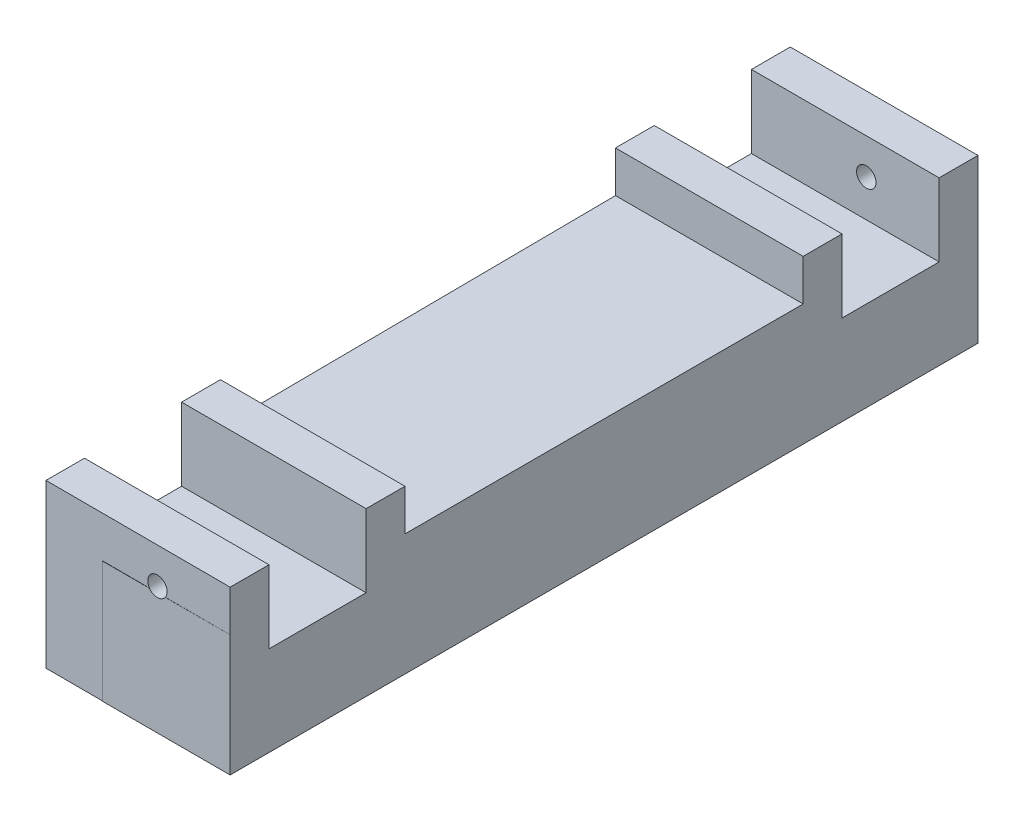
ISO-10303-21;
HEADER;
FILE_DESCRIPTION(('STEP AP214'),'2;1');
FILE_NAME('part.step','',(''),(''),'','','');
FILE_SCHEMA(('AUTOMOTIVE_DESIGN { 1 0 10303 214 1 1 1 1 }'));
ENDSEC;
DATA;
#1=APPLICATION_CONTEXT('core data for automotive mechanical design processes');
#2=APPLICATION_PROTOCOL_DEFINITION('international standard','automotive_design',2000,#1);
#3=PRODUCT_CONTEXT('',#1,'mechanical');
#4=PRODUCT('Part','Part','',(#3));
#5=PRODUCT_RELATED_PRODUCT_CATEGORY('part','',(#4));
#6=PRODUCT_DEFINITION_FORMATION('','',#4);
#7=PRODUCT_DEFINITION_CONTEXT('part definition',#1,'design');
#8=PRODUCT_DEFINITION('design','',#6,#7);
#9=PRODUCT_DEFINITION_SHAPE('','',#8);
#10=(LENGTH_UNIT() NAMED_UNIT(*) SI_UNIT(.MILLI.,.METRE.));
#11=(NAMED_UNIT(*) PLANE_ANGLE_UNIT() SI_UNIT($,.RADIAN.));
#12=(NAMED_UNIT(*) SI_UNIT($,.STERADIAN.) SOLID_ANGLE_UNIT());
#13=UNCERTAINTY_MEASURE_WITH_UNIT(LENGTH_MEASURE(1.E-05),#10,'distance_accuracy_value','');
#14=(GEOMETRIC_REPRESENTATION_CONTEXT(3) GLOBAL_UNCERTAINTY_ASSIGNED_CONTEXT((#13)) GLOBAL_UNIT_ASSIGNED_CONTEXT((#10,
#11,#12)) REPRESENTATION_CONTEXT('',''));
#15=CARTESIAN_POINT('',(0.,0.,0.));
#16=DIRECTION('',(0.,0.,1.));
#17=DIRECTION('',(1.,0.,0.));
#18=AXIS2_PLACEMENT_3D('',#15,#16,#17);
#19=CARTESIAN_POINT('',(0.,19.8480422527837,0.));
#20=DIRECTION('',(0.,1.,0.));
#21=DIRECTION('',(0.,0.,1.));
#22=AXIS2_PLACEMENT_3D('',#19,#20,#21);
#23=PLANE('',#22);
#24=DIRECTION('',(-1.,0.,0.));
#25=VECTOR('',#24,1.);
#26=CARTESIAN_POINT('',(30.,19.8480422527837,20.2557768746774));
#27=LINE('',#26,#25);
#28=CARTESIAN_POINT('',(30.,19.8480422527837,20.2557768746774));
#29=VERTEX_POINT('',#28);
#30=CARTESIAN_POINT('',(-8.,19.8480422527837,20.2557768746774));
#31=VERTEX_POINT('',#30);
#32=EDGE_CURVE('E230',#29,#31,#27,.T.);
#33=ORIENTED_EDGE('',*,*,#32,.T.);
#34=DIRECTION('',(0.,0.,1.));
#35=VECTOR('',#34,1.);
#36=CARTESIAN_POINT('',(-8.00000000000001,19.8480422527837,0.));
#37=LINE('',#36,#35);
#38=CARTESIAN_POINT('',(-8.,19.8480422527837,28.1760513106727));
#39=VERTEX_POINT('',#38);
#40=EDGE_CURVE('E217',#31,#39,#37,.T.);
#41=ORIENTED_EDGE('',*,*,#40,.T.);
#42=DIRECTION('',(0.999997799118915,0.,0.00209803654047904));
#43=VECTOR('',#42,1.);
#44=CARTESIAN_POINT('',(-8.,19.8480422527837,28.1760513106727));
#45=LINE('',#44,#43);
#46=CARTESIAN_POINT('',(3.71210697398439,19.8480422527837,28.2006237931513));
#47=VERTEX_POINT('',#46);
#48=EDGE_CURVE('E235',#39,#47,#45,.T.);
#49=ORIENTED_EDGE('',*,*,#48,.T.);
#50=DIRECTION('',(0.999997799118915,0.,0.00209803654047904));
#51=VECTOR('',#50,1.);
#52=CARTESIAN_POINT('',(-8.,19.8480422527837,28.1760513106727));
#53=LINE('',#52,#51);
#54=CARTESIAN_POINT('',(30.,19.8480422527837,28.2557768746774));
#55=VERTEX_POINT('',#54);
#56=EDGE_CURVE('E106',#47,#55,#53,.T.);
#57=ORIENTED_EDGE('',*,*,#56,.T.);
#58=DIRECTION('',(0.,0.,-1.));
#59=VECTOR('',#58,1.);
#60=CARTESIAN_POINT('',(30.,19.8480422527837,28.2557768746774));
#61=LINE('',#60,#59);
#62=EDGE_CURVE('E229',#55,#29,#61,.T.);
#63=ORIENTED_EDGE('',*,*,#62,.T.);
#64=EDGE_LOOP('',(#33,#41,#49,#57,#63));
#65=FACE_BOUND('',#64,.T.);
#66=ADVANCED_FACE('F50',(#65),#23,.T.);
#67=CARTESIAN_POINT('',(0.,19.8480422527837,0.));
#68=DIRECTION('',(0.,1.,0.));
#69=DIRECTION('',(0.,0.,1.));
#70=AXIS2_PLACEMENT_3D('',#67,#68,#69);
#71=PLANE('',#70);
#72=DIRECTION('',(-1.,0.,0.));
#73=VECTOR('',#72,1.);
#74=CARTESIAN_POINT('',(30.,19.8480422527837,-97.7442231253226));
#75=LINE('',#74,#73);
#76=CARTESIAN_POINT('',(30.,19.8480422527837,-97.7442231253226));
#77=VERTEX_POINT('',#76);
#78=CARTESIAN_POINT('',(-8.65807185361689,19.8480422527837,-97.7442231253226));
#79=VERTEX_POINT('',#78);
#80=EDGE_CURVE('E360',#77,#79,#75,.T.);
#81=ORIENTED_EDGE('',*,*,#80,.T.);
#82=DIRECTION('',(0.,0.,1.));
#83=VECTOR('',#82,1.);
#84=CARTESIAN_POINT('',(-8.65807185361689,19.8480422527837,0.));
#85=LINE('',#84,#83);
#86=CARTESIAN_POINT('',(-8.65807185361689,19.8480422527837,-89.7442231253226));
#87=VERTEX_POINT('',#86);
#88=EDGE_CURVE('E240',#79,#87,#85,.T.);
#89=ORIENTED_EDGE('',*,*,#88,.T.);
#90=DIRECTION('',(1.,0.,0.));
#91=VECTOR('',#90,1.);
#92=CARTESIAN_POINT('',(-8.65807185361689,19.8480422527837,-89.7442231253226));
#93=LINE('',#92,#91);
#94=CARTESIAN_POINT('',(30.,19.8480422527837,-89.7442231253226));
#95=VERTEX_POINT('',#94);
#96=EDGE_CURVE('E225',#87,#95,#93,.T.);
#97=ORIENTED_EDGE('',*,*,#96,.T.);
#98=DIRECTION('',(0.,0.,-1.));
#99=VECTOR('',#98,1.);
#100=CARTESIAN_POINT('',(30.,19.8480422527837,-89.7442231253226));
#101=LINE('',#100,#99);
#102=EDGE_CURVE('E358',#95,#77,#101,.T.);
#103=ORIENTED_EDGE('',*,*,#102,.T.);
#104=EDGE_LOOP('',(#81,#89,#97,#103));
#105=FACE_BOUND('',#104,.T.);
#106=ADVANCED_FACE('F489',(#105),#71,.T.);
#107=CARTESIAN_POINT('',(-8.65807185361689,19.8480422527837,-117.744223125323));
#108=DIRECTION('',(1.,0.,0.));
#109=DIRECTION('',(0.,0.,-1.));
#110=AXIS2_PLACEMENT_3D('',#107,#108,#109);
#111=PLANE('',#110);
#112=DIRECTION('',(0.,1.,0.));
#113=VECTOR('',#112,1.);
#114=CARTESIAN_POINT('',(-8.65807185361689,4.84804225278371,-97.7442231253226));
#115=LINE('',#114,#113);
#116=CARTESIAN_POINT('',(-8.65807185361689,4.84804225278371,-97.7442231253226));
#117=VERTEX_POINT('',#116);
#118=EDGE_CURVE('E281',#117,#79,#115,.T.);
#119=ORIENTED_EDGE('',*,*,#118,.F.);
#120=DIRECTION('',(0.,0.,1.));
#121=VECTOR('',#120,1.);
#122=CARTESIAN_POINT('',(-8.65807185361689,4.84804225278371,-117.744223125323));
#123=LINE('',#122,#121);
#124=CARTESIAN_POINT('',(-8.65807185361689,4.84804225278371,-117.744223125323));
#125=VERTEX_POINT('',#124);
#126=EDGE_CURVE('E54',#125,#117,#123,.T.);
#127=ORIENTED_EDGE('',*,*,#126,.F.);
#128=DIRECTION('',(0.,1.,0.));
#129=VECTOR('',#128,1.);
#130=CARTESIAN_POINT('',(-8.65807185361689,19.8480422527837,-117.744223125323));
#131=LINE('',#130,#129);
#132=CARTESIAN_POINT('',(-8.65807185361689,19.8480422527837,-117.744223125323));
#133=VERTEX_POINT('',#132);
#134=EDGE_CURVE('E11',#125,#133,#131,.T.);
#135=ORIENTED_EDGE('',*,*,#134,.T.);
#136=CARTESIAN_POINT('',(-8.65807185361689,19.8480422527837,-125.744223125323));
#137=VERTEX_POINT('',#136);
#138=EDGE_CURVE('E234',#137,#133,#85,.T.);
#139=ORIENTED_EDGE('',*,*,#138,.F.);
#140=DIRECTION('',(0.,-1.,0.));
#141=VECTOR('',#140,1.);
#142=CARTESIAN_POINT('',(-8.65807185361689,19.8480422527837,-125.744223125323));
#143=LINE('',#142,#141);
#144=CARTESIAN_POINT('',(-8.65807185361689,-13.6519577472163,-125.744223125323));
#145=VERTEX_POINT('',#144);
#146=EDGE_CURVE('E245',#137,#145,#143,.T.);
#147=ORIENTED_EDGE('',*,*,#146,.T.);
#148=DIRECTION('',(0.,0.,1.));
#149=VECTOR('',#148,1.);
#150=CARTESIAN_POINT('',(-8.65807185361689,-13.6519577472163,0.));
#151=LINE('',#150,#149);
#152=CARTESIAN_POINT('',(-8.65807185361689,-13.6519577472163,-89.7442231253226));
#153=VERTEX_POINT('',#152);
#154=EDGE_CURVE('E298',#145,#153,#151,.T.);
#155=ORIENTED_EDGE('',*,*,#154,.T.);
#156=DIRECTION('',(0.,1.,0.));
#157=VECTOR('',#156,1.);
#158=CARTESIAN_POINT('',(-8.65807185361689,-13.6519577472163,-89.7442231253226));
#159=LINE('',#158,#157);
#160=CARTESIAN_POINT('',(-8.65807185361689,11.3480422527837,-89.7442231253226));
#161=VERTEX_POINT('',#160);
#162=EDGE_CURVE('E71',#153,#161,#159,.T.);
#163=ORIENTED_EDGE('',*,*,#162,.T.);
#164=DIRECTION('',(0.,-1.,0.));
#165=VECTOR('',#164,1.);
#166=CARTESIAN_POINT('',(-8.65807185361689,19.8480422527837,-89.7442231253226));
#167=LINE('',#166,#165);
#168=EDGE_CURVE('E246',#87,#161,#167,.T.);
#169=ORIENTED_EDGE('',*,*,#168,.F.);
#170=ORIENTED_EDGE('',*,*,#88,.F.);
#171=EDGE_LOOP('',(#119,#127,#135,#139,#147,#155,#163,#169,#170));
#172=FACE_BOUND('',#171,.T.);
#173=ADVANCED_FACE('F283',(#172),#111,.F.);
#174=CARTESIAN_POINT('',(30.,11.3480422527837,0.255776874677423));
#175=DIRECTION('',(0.,-1.,0.));
#176=DIRECTION('',(0.,0.,-1.));
#177=AXIS2_PLACEMENT_3D('',#174,#175,#176);
#178=PLANE('',#177);
#179=DIRECTION('',(-0.00802500808675201,0.,-0.999967799104155));
#180=VECTOR('',#179,1.);
#181=CARTESIAN_POINT('',(-7.93335477392348,11.3480422527837,0.560202156262577));
#182=LINE('',#181,#180);
#183=CARTESIAN_POINT('',(-8.00000000000001,11.3480422527837,-7.74422312532257));
#184=VERTEX_POINT('',#183);
#185=EDGE_CURVE('E313',#184,#161,#182,.T.);
#186=ORIENTED_EDGE('',*,*,#185,.F.);
#187=DIRECTION('',(-1.,0.,0.));
#188=VECTOR('',#187,1.);
#189=CARTESIAN_POINT('',(30.,11.3480422527837,-7.74422312532258));
#190=LINE('',#189,#188);
#191=CARTESIAN_POINT('',(30.,11.3480422527837,-7.74422312532258));
#192=VERTEX_POINT('',#191);
#193=EDGE_CURVE('E350',#192,#184,#190,.T.);
#194=ORIENTED_EDGE('',*,*,#193,.F.);
#195=DIRECTION('',(0.,0.,1.));
#196=VECTOR('',#195,1.);
#197=CARTESIAN_POINT('',(30.,11.3480422527837,0.255776874677423));
#198=LINE('',#197,#196);
#199=CARTESIAN_POINT('',(30.,11.3480422527837,-89.7442231253226));
#200=VERTEX_POINT('',#199);
#201=EDGE_CURVE('E210',#200,#192,#198,.T.);
#202=ORIENTED_EDGE('',*,*,#201,.F.);
#203=DIRECTION('',(1.,0.,0.));
#204=VECTOR('',#203,1.);
#205=CARTESIAN_POINT('',(-8.65807185361689,11.3480422527837,-89.7442231253226));
#206=LINE('',#205,#204);
#207=EDGE_CURVE('E208',#161,#200,#206,.T.);
#208=ORIENTED_EDGE('',*,*,#207,.F.);
#209=EDGE_LOOP('',(#186,#194,#202,#208));
#210=FACE_BOUND('',#209,.T.);
#211=ADVANCED_FACE('F413',(#210),#178,.F.);
#212=DIRECTION('',(-1.,0.,0.));
#213=VECTOR('',#212,1.);
#214=CARTESIAN_POINT('',(0.278635772857573,11.3480422527837,20.2557768746774));
#215=LINE('',#214,#213);
#216=CARTESIAN_POINT('',(16.6530617344952,11.3480422527837,20.2557768746774));
#217=VERTEX_POINT('',#216);
#218=CARTESIAN_POINT('',(16.6363068171954,11.3480422527837,20.2557768746774));
#219=VERTEX_POINT('',#218);
#220=EDGE_CURVE('E337',#217,#219,#215,.T.);
#221=ORIENTED_EDGE('',*,*,#220,.T.);
#222=DIRECTION('',(0.,0.,1.));
#223=VECTOR('',#222,1.);
#224=CARTESIAN_POINT('',(16.6363068171954,11.3480422527837,-132.745223125323));
#225=LINE('',#224,#223);
#226=CARTESIAN_POINT('',(16.6363068171954,11.3480422527837,28.2557768746774));
#227=VERTEX_POINT('',#226);
#228=EDGE_CURVE('E325',#227,#219,#225,.F.);
#229=ORIENTED_EDGE('',*,*,#228,.F.);
#230=DIRECTION('',(-1.,0.,0.));
#231=VECTOR('',#230,1.);
#232=CARTESIAN_POINT('',(30.,11.3480422527837,28.2557768746774));
#233=LINE('',#232,#231);
#234=CARTESIAN_POINT('',(30.,11.3480422527837,28.2557768746774));
#235=VERTEX_POINT('',#234);
#236=EDGE_CURVE('E260',#235,#227,#233,.T.);
#237=ORIENTED_EDGE('',*,*,#236,.F.);
#238=DIRECTION('',(0.999997799118916,0.,0.00209803654047904));
#239=VECTOR('',#238,1.);
#240=CARTESIAN_POINT('',(-8.,11.3480422527837,28.1760513106727));
#241=LINE('',#240,#239);
#242=CARTESIAN_POINT('',(16.6363362290949,11.3480422527837,28.2277393580642));
#243=VERTEX_POINT('',#242);
#244=EDGE_CURVE('E352',#243,#235,#241,.T.);
#245=ORIENTED_EDGE('',*,*,#244,.F.);
#246=DIRECTION('',(-0.00209803654047904,0.,0.999997799118915));
#247=VECTOR('',#246,1.);
#248=CARTESIAN_POINT('',(16.9741214711236,11.3480422527837,-132.772554052637));
#249=LINE('',#248,#247);
#250=EDGE_CURVE('E331',#217,#243,#249,.T.);
#251=ORIENTED_EDGE('',*,*,#250,.F.);
#252=EDGE_LOOP('',(#221,#229,#237,#245,#251));
#253=FACE_BOUND('',#252,.T.);
#254=ADVANCED_FACE('F458',(#253),#178,.F.);
#255=CARTESIAN_POINT('',(30.,-13.6519577472163,28.2557768746774));
#256=DIRECTION('',(0.,0.,-1.));
#257=DIRECTION('',(-1.,0.,0.));
#258=AXIS2_PLACEMENT_3D('',#255,#256,#257);
#259=PLANE('',#258);
#260=CARTESIAN_POINT('',(13.3636931828046,11.3480422527837,28.2557768746774));
#261=VERTEX_POINT('',#260);
#262=CARTESIAN_POINT('',(3.71199126054937,11.3480422527837,28.2557768746774));
#263=VERTEX_POINT('',#262);
#264=EDGE_CURVE('E400',#261,#263,#233,.T.);
#265=ORIENTED_EDGE('',*,*,#264,.T.);
#266=DIRECTION('',(0.,-1.,0.));
#267=VECTOR('',#266,1.);
#268=CARTESIAN_POINT('',(3.71199126054937,-13.6519577472163,28.2557768746774));
#269=LINE('',#268,#267);
#270=CARTESIAN_POINT('',(3.71199126054937,-13.6519577472163,28.2557768746775));
#271=VERTEX_POINT('',#270);
#272=EDGE_CURVE('E323',#263,#271,#269,.T.);
#273=ORIENTED_EDGE('',*,*,#272,.T.);
#274=DIRECTION('',(-1.,0.,0.));
#275=VECTOR('',#274,1.);
#276=CARTESIAN_POINT('',(30.,-13.6519577472163,28.2557768746774));
#277=LINE('',#276,#275);
#278=CARTESIAN_POINT('',(30.,-13.6519577472163,28.2557768746774));
#279=VERTEX_POINT('',#278);
#280=EDGE_CURVE('E391',#279,#271,#277,.T.);
#281=ORIENTED_EDGE('',*,*,#280,.F.);
#282=DIRECTION('',(0.,-1.,0.));
#283=VECTOR('',#282,1.);
#284=CARTESIAN_POINT('',(30.,-13.6519577472163,28.2557768746774));
#285=LINE('',#284,#283);
#286=EDGE_CURVE('E374',#235,#279,#285,.T.);
#287=ORIENTED_EDGE('',*,*,#286,.F.);
#288=ORIENTED_EDGE('',*,*,#236,.T.);
#289=CARTESIAN_POINT('',(15.,12.4980422527837,28.2557768746774));
#290=DIRECTION('',(0.,0.,1.));
#291=DIRECTION('',(1.,0.,0.));
#292=AXIS2_PLACEMENT_3D('',#289,#290,#291);
#293=CIRCLE('',#292,2.);
#294=EDGE_CURVE('E176',#261,#227,#293,.T.);
#295=ORIENTED_EDGE('',*,*,#294,.F.);
#296=EDGE_LOOP('',(#265,#273,#281,#287,#288,#295));
#297=FACE_BOUND('',#296,.T.);
#298=ADVANCED_FACE('F47',(#297),#259,.F.);
#299=CARTESIAN_POINT('',(15.3378182552449,12.4980422527837,-132.775987084131));
#300=DIRECTION('',(-0.00209803654047904,0.,0.999997799118915));
#301=DIRECTION('',(0.999997799118916,0.,0.00209803654047904));
#302=AXIS2_PLACEMENT_3D('',#299,#300,#301);
#303=CYLINDRICAL_SURFACE('',#302,2.00000000000001);
#304=CARTESIAN_POINT('',(15.,12.4980422527837,28.2400415833069));
#305=DIRECTION('',(0.999999449779577,0.,0.00104901884746472));
#306=DIRECTION('',(-0.00104901884743111,0.,0.999999449779577));
#307=AXIS2_PLACEMENT_3D('',#304,#305,#306);
#308=ELLIPSE('',#307,1906.54343805705,2.);
#309=CARTESIAN_POINT('',(15.0083756487708,14.4980247148337,20.2557768746774));
#310=VERTEX_POINT('',#309);
#311=CARTESIAN_POINT('',(15.0000165066263,14.4980422527156,28.2243062919388));
#312=VERTEX_POINT('',#311);
#313=EDGE_CURVE('E163',#310,#312,#308,.T.);
#314=ORIENTED_EDGE('',*,*,#313,.F.);
#315=CARTESIAN_POINT('',(15.0167513159752,12.4980422527837,20.2557768746774));
#316=DIRECTION('',(0.,0.,1.));
#317=DIRECTION('',(-1.,0.,0.));
#318=AXIS2_PLACEMENT_3D('',#315,#316,#317);
#319=ELLIPSE('',#318,2.00000440177186,2.00000000000001);
#320=EDGE_CURVE('E332',#310,#217,#319,.F.);
#321=ORIENTED_EDGE('',*,*,#320,.T.);
#322=ORIENTED_EDGE('',*,*,#250,.T.);
#323=CARTESIAN_POINT('',(15.0000330132163,12.4980422527837,28.2243063265703));
#324=DIRECTION('',(-0.00209803654047908,0.,0.999997799118916));
#325=DIRECTION('',(0.999997799118916,0.,0.00209803654047908));
#326=AXIS2_PLACEMENT_3D('',#323,#324,#325);
#327=CIRCLE('',#326,2.00000000000001);
#328=EDGE_CURVE('E340',#243,#312,#327,.T.);
#329=ORIENTED_EDGE('',*,*,#328,.T.);
#330=EDGE_LOOP('',(#314,#321,#322,#329));
#331=FACE_BOUND('',#330,.T.);
#332=ADVANCED_FACE('F467',(#331),#303,.F.);
#333=CARTESIAN_POINT('',(3.7121069739844,11.3480422527837,28.2006237931513));
#334=VERTEX_POINT('',#333);
#335=CARTESIAN_POINT('',(13.3636931828046,11.3480422527837,28.2208732182575));
#336=VERTEX_POINT('',#335);
#337=EDGE_CURVE('E167',#334,#336,#241,.T.);
#338=ORIENTED_EDGE('',*,*,#337,.F.);
#339=DIRECTION('',(-0.00209803654047905,0.,0.999997799118916));
#340=VECTOR('',#339,1.);
#341=CARTESIAN_POINT('',(3.770851867827,11.3480422527837,0.20074704235637));
#342=LINE('',#341,#340);
#343=EDGE_CURVE('E319',#334,#263,#342,.T.);
#344=ORIENTED_EDGE('',*,*,#343,.T.);
#345=ORIENTED_EDGE('',*,*,#264,.F.);
#346=DIRECTION('',(0.,0.,1.));
#347=VECTOR('',#346,1.);
#348=CARTESIAN_POINT('',(13.3636931828046,11.3480422527837,-132.745223125323));
#349=LINE('',#348,#347);
#350=EDGE_CURVE('E326',#336,#261,#349,.T.);
#351=ORIENTED_EDGE('',*,*,#350,.F.);
#352=EDGE_LOOP('',(#338,#344,#345,#351));
#353=FACE_BOUND('',#352,.T.);
#354=ADVANCED_FACE('F455',(#353),#178,.F.);
#355=CARTESIAN_POINT('',(30.,-3.65195774721628,-117.744223125323));
#356=DIRECTION('',(0.,0.,-1.));
#357=DIRECTION('',(-1.,0.,0.));
#358=AXIS2_PLACEMENT_3D('',#355,#356,#357);
#359=PLANE('',#358);
#360=CARTESIAN_POINT('',(15.,12.4980422527837,-117.744223125323));
#361=DIRECTION('',(0.,0.,-1.));
#362=DIRECTION('',(-1.,0.,0.));
#363=AXIS2_PLACEMENT_3D('',#360,#361,#362);
#364=CIRCLE('',#363,2.);
#365=CARTESIAN_POINT('',(13.,12.4980422527837,-117.744223125323));
#366=VERTEX_POINT('',#365);
#367=EDGE_CURVE('E345',#366,#366,#364,.F.);
#368=ORIENTED_EDGE('',*,*,#367,.F.);
#369=EDGE_LOOP('',(#368));
#370=FACE_BOUND('',#369,.T.);
#371=DIRECTION('',(-1.,0.,0.));
#372=VECTOR('',#371,1.);
#373=CARTESIAN_POINT('',(30.,4.84804225278373,-117.744223125323));
#374=LINE('',#373,#372);
#375=CARTESIAN_POINT('',(30.,4.84804225278373,-117.744223125323));
#376=VERTEX_POINT('',#375);
#377=EDGE_CURVE('E278',#376,#125,#374,.T.);
#378=ORIENTED_EDGE('',*,*,#377,.F.);
#379=DIRECTION('',(0.,-1.,0.));
#380=VECTOR('',#379,1.);
#381=CARTESIAN_POINT('',(30.,-3.65195774721628,-117.744223125323));
#382=LINE('',#381,#380);
#383=CARTESIAN_POINT('',(30.,19.8480422527837,-117.744223125323));
#384=VERTEX_POINT('',#383);
#385=EDGE_CURVE('E384',#384,#376,#382,.T.);
#386=ORIENTED_EDGE('',*,*,#385,.F.);
#387=DIRECTION('',(1.,0.,0.));
#388=VECTOR('',#387,1.);
#389=CARTESIAN_POINT('',(0.,19.8480422527837,-117.744223125323));
#390=LINE('',#389,#388);
#391=EDGE_CURVE('E365',#133,#384,#390,.T.);
#392=ORIENTED_EDGE('',*,*,#391,.F.);
#393=ORIENTED_EDGE('',*,*,#134,.F.);
#394=EDGE_LOOP('',(#378,#386,#392,#393));
#395=FACE_BOUND('',#394,.T.);
#396=ADVANCED_FACE('F534',(#370,#395),#359,.F.);
#397=CARTESIAN_POINT('',(30.,11.3480422527837,-97.7442231253226));
#398=DIRECTION('',(0.,0.,1.));
#399=DIRECTION('',(0.,-1.,0.));
#400=AXIS2_PLACEMENT_3D('',#397,#398,#399);
#401=PLANE('',#400);
#402=DIRECTION('',(1.,0.,0.));
#403=VECTOR('',#402,1.);
#404=CARTESIAN_POINT('',(0.,4.84804225278373,-97.7442231253226));
#405=LINE('',#404,#403);
#406=CARTESIAN_POINT('',(30.,4.84804225278373,-97.7442231253226));
#407=VERTEX_POINT('',#406);
#408=EDGE_CURVE('E244',#117,#407,#405,.T.);
#409=ORIENTED_EDGE('',*,*,#408,.F.);
#410=ORIENTED_EDGE('',*,*,#118,.T.);
#411=ORIENTED_EDGE('',*,*,#80,.F.);
#412=DIRECTION('',(0.,1.,0.));
#413=VECTOR('',#412,1.);
#414=CARTESIAN_POINT('',(30.,11.3480422527837,-97.7442231253226));
#415=LINE('',#414,#413);
#416=EDGE_CURVE('E388',#407,#77,#415,.T.);
#417=ORIENTED_EDGE('',*,*,#416,.F.);
#418=EDGE_LOOP('',(#409,#410,#411,#417));
#419=FACE_BOUND('',#418,.T.);
#420=ADVANCED_FACE('F532',(#419),#401,.F.);
#421=CARTESIAN_POINT('',(30.,-3.65195774721629,0.255776874677423));
#422=DIRECTION('',(0.,0.,-1.));
#423=DIRECTION('',(-1.,0.,0.));
#424=AXIS2_PLACEMENT_3D('',#421,#422,#423);
#425=PLANE('',#424);
#426=DIRECTION('',(-1.,0.,0.));
#427=VECTOR('',#426,1.);
#428=CARTESIAN_POINT('',(30.,4.84804225278371,0.255776874677425));
#429=LINE('',#428,#427);
#430=CARTESIAN_POINT('',(30.,4.84804225278371,0.255776874677423));
#431=VERTEX_POINT('',#430);
#432=CARTESIAN_POINT('',(-8.00000000000001,4.84804225278371,0.255776874677423));
#433=VERTEX_POINT('',#432);
#434=EDGE_CURVE('E64',#431,#433,#429,.T.);
#435=ORIENTED_EDGE('',*,*,#434,.F.);
#436=DIRECTION('',(0.,-1.,0.));
#437=VECTOR('',#436,1.);
#438=CARTESIAN_POINT('',(30.,-3.65195774721629,0.255776874677423));
#439=LINE('',#438,#437);
#440=CARTESIAN_POINT('',(30.,19.8480422527837,0.255776874677424));
#441=VERTEX_POINT('',#440);
#442=EDGE_CURVE('E190',#441,#431,#439,.T.);
#443=ORIENTED_EDGE('',*,*,#442,.F.);
#444=DIRECTION('',(1.,0.,0.));
#445=VECTOR('',#444,1.);
#446=CARTESIAN_POINT('',(0.,19.8480422527837,0.255776874677424));
#447=LINE('',#446,#445);
#448=CARTESIAN_POINT('',(-8.00000000000001,19.8480422527837,0.255776874677424));
#449=VERTEX_POINT('',#448);
#450=EDGE_CURVE('E196',#449,#441,#447,.T.);
#451=ORIENTED_EDGE('',*,*,#450,.F.);
#452=DIRECTION('',(0.,1.,0.));
#453=VECTOR('',#452,1.);
#454=CARTESIAN_POINT('',(-8.00000000000001,19.8480422527837,0.255776874677424));
#455=LINE('',#454,#453);
#456=EDGE_CURVE('E265',#433,#449,#455,.T.);
#457=ORIENTED_EDGE('',*,*,#456,.F.);
#458=EDGE_LOOP('',(#435,#443,#451,#457));
#459=FACE_BOUND('',#458,.T.);
#460=ADVANCED_FACE('F528',(#459),#425,.F.);
#461=CARTESIAN_POINT('',(30.,11.3480422527837,20.2557768746774));
#462=DIRECTION('',(0.,0.,1.));
#463=DIRECTION('',(1.,0.,0.));
#464=AXIS2_PLACEMENT_3D('',#461,#462,#463);
#465=PLANE('',#464);
#466=ORIENTED_EDGE('',*,*,#320,.F.);
#467=CARTESIAN_POINT('',(15.,12.4980422527837,20.2557768746774));
#468=DIRECTION('',(0.,0.,1.));
#469=DIRECTION('',(1.,0.,0.));
#470=AXIS2_PLACEMENT_3D('',#467,#468,#469);
#471=CIRCLE('',#470,2.);
#472=EDGE_CURVE('E321',#219,#310,#471,.F.);
#473=ORIENTED_EDGE('',*,*,#472,.F.);
#474=ORIENTED_EDGE('',*,*,#220,.F.);
#475=EDGE_LOOP('',(#466,#473,#474));
#476=FACE_BOUND('',#475,.T.);
#477=DIRECTION('',(1.,0.,0.));
#478=VECTOR('',#477,1.);
#479=CARTESIAN_POINT('',(0.,4.84804225278371,20.2557768746774));
#480=LINE('',#479,#478);
#481=CARTESIAN_POINT('',(-8.,4.84804225278371,20.2557768746774));
#482=VERTEX_POINT('',#481);
#483=CARTESIAN_POINT('',(30.,4.84804225278371,20.2557768746774));
#484=VERTEX_POINT('',#483);
#485=EDGE_CURVE('E375',#482,#484,#480,.T.);
#486=ORIENTED_EDGE('',*,*,#485,.F.);
#487=DIRECTION('',(0.,-1.,0.));
#488=VECTOR('',#487,1.);
#489=CARTESIAN_POINT('',(-8.,19.8480422527837,20.2557768746774));
#490=LINE('',#489,#488);
#491=EDGE_CURVE('E257',#31,#482,#490,.T.);
#492=ORIENTED_EDGE('',*,*,#491,.F.);
#493=ORIENTED_EDGE('',*,*,#32,.F.);
#494=DIRECTION('',(0.,1.,0.));
#495=VECTOR('',#494,1.);
#496=CARTESIAN_POINT('',(30.,11.3480422527837,20.2557768746774));
#497=LINE('',#496,#495);
#498=EDGE_CURVE('E112',#484,#29,#497,.T.);
#499=ORIENTED_EDGE('',*,*,#498,.F.);
#500=EDGE_LOOP('',(#486,#492,#493,#499));
#501=FACE_BOUND('',#500,.T.);
#502=ADVANCED_FACE('F473',(#476,#501),#465,.F.);
#503=CARTESIAN_POINT('',(30.,-13.6519577472163,-125.744223125323));
#504=DIRECTION('',(0.,1.,0.));
#505=DIRECTION('',(0.,0.,1.));
#506=AXIS2_PLACEMENT_3D('',#503,#504,#505);
#507=PLANE('',#506);
#508=ORIENTED_EDGE('',*,*,#280,.T.);
#509=DIRECTION('',(0.00209803654047905,0.,-0.999997799118916));
#510=VECTOR('',#509,1.);
#511=CARTESIAN_POINT('',(3.77125644315547,-13.6519577472163,0.0079122512351813));
#512=LINE('',#511,#510);
#513=CARTESIAN_POINT('',(3.7121069739844,-13.6519577472163,28.2006237931513));
#514=VERTEX_POINT('',#513);
#515=EDGE_CURVE('E296',#271,#514,#512,.T.);
#516=ORIENTED_EDGE('',*,*,#515,.T.);
#517=DIRECTION('',(-0.999997799118916,0.,-0.00209803654047898));
#518=VECTOR('',#517,1.);
#519=CARTESIAN_POINT('',(-0.0591494691710713,-13.6519577472163,28.1927115419161));
#520=LINE('',#519,#518);
#521=CARTESIAN_POINT('',(-8.,-13.6519577472163,28.1760513106727));
#522=VERTEX_POINT('',#521);
#523=EDGE_CURVE('E301',#514,#522,#520,.T.);
#524=ORIENTED_EDGE('',*,*,#523,.T.);
#525=DIRECTION('',(0.,0.,1.));
#526=VECTOR('',#525,1.);
#527=CARTESIAN_POINT('',(-8.00000000000001,-13.6519577472163,0.));
#528=LINE('',#527,#526);
#529=CARTESIAN_POINT('',(-8.00000000000001,-13.6519577472163,-7.74422312532257));
#530=VERTEX_POINT('',#529);
#531=EDGE_CURVE('E287',#530,#522,#528,.T.);
#532=ORIENTED_EDGE('',*,*,#531,.F.);
#533=DIRECTION('',(0.00802500808675201,0.,0.999967799104155));
#534=VECTOR('',#533,1.);
#535=CARTESIAN_POINT('',(-7.93733934195901,-13.6519577472163,0.0636992635798679));
#536=LINE('',#535,#534);
#537=EDGE_CURVE('E292',#153,#530,#536,.T.);
#538=ORIENTED_EDGE('',*,*,#537,.F.);
#539=ORIENTED_EDGE('',*,*,#154,.F.);
#540=DIRECTION('',(-1.,0.,0.));
#541=VECTOR('',#540,1.);
#542=CARTESIAN_POINT('',(30.,-13.6519577472163,-125.744223125323));
#543=LINE('',#542,#541);
#544=CARTESIAN_POINT('',(30.,-13.6519577472163,-125.744223125323));
#545=VERTEX_POINT('',#544);
#546=EDGE_CURVE('E392',#545,#145,#543,.T.);
#547=ORIENTED_EDGE('',*,*,#546,.F.);
#548=DIRECTION('',(0.,0.,-1.));
#549=VECTOR('',#548,1.);
#550=CARTESIAN_POINT('',(30.,-13.6519577472163,-125.744223125323));
#551=LINE('',#550,#549);
#552=EDGE_CURVE('E379',#279,#545,#551,.T.);
#553=ORIENTED_EDGE('',*,*,#552,.F.);
#554=EDGE_LOOP('',(#508,#516,#524,#532,#538,#539,#547,#553));
#555=FACE_BOUND('',#554,.T.);
#556=ADVANCED_FACE('F530',(#555),#507,.F.);
#557=CARTESIAN_POINT('',(30.,11.3480422527837,-125.744223125323));
#558=DIRECTION('',(0.,0.,1.));
#559=DIRECTION('',(0.,-1.,0.));
#560=AXIS2_PLACEMENT_3D('',#557,#558,#559);
#561=PLANE('',#560);
#562=CARTESIAN_POINT('',(15.,12.4980422527837,-125.744223125323));
#563=DIRECTION('',(0.,0.,-1.));
#564=DIRECTION('',(0.,1.,0.));
#565=AXIS2_PLACEMENT_3D('',#562,#563,#564);
#566=CIRCLE('',#565,2.);
#567=CARTESIAN_POINT('',(15.,14.4980422527837,-125.744223125323));
#568=VERTEX_POINT('',#567);
#569=EDGE_CURVE('E344',#568,#568,#566,.T.);
#570=ORIENTED_EDGE('',*,*,#569,.F.);
#571=EDGE_LOOP('',(#570));
#572=FACE_BOUND('',#571,.T.);
#573=ORIENTED_EDGE('',*,*,#546,.T.);
#574=ORIENTED_EDGE('',*,*,#146,.F.);
#575=DIRECTION('',(1.,0.,0.));
#576=VECTOR('',#575,1.);
#577=CARTESIAN_POINT('',(0.,19.8480422527837,-125.744223125323));
#578=LINE('',#577,#576);
#579=CARTESIAN_POINT('',(3.21766061210838,19.8480422527837,-125.744223125323));
#580=VERTEX_POINT('',#579);
#581=EDGE_CURVE('E238',#580,#137,#578,.F.);
#582=ORIENTED_EDGE('',*,*,#581,.F.);
#583=DIRECTION('',(1.,0.,0.));
#584=VECTOR('',#583,1.);
#585=CARTESIAN_POINT('',(0.,19.8480422527837,-125.744223125323));
#586=LINE('',#585,#584);
#587=CARTESIAN_POINT('',(30.,19.8480422527837,-125.744223125323));
#588=VERTEX_POINT('',#587);
#589=EDGE_CURVE('E239',#588,#580,#586,.F.);
#590=ORIENTED_EDGE('',*,*,#589,.F.);
#591=DIRECTION('',(0.,1.,0.));
#592=VECTOR('',#591,1.);
#593=CARTESIAN_POINT('',(30.,11.3480422527837,-125.744223125323));
#594=LINE('',#593,#592);
#595=EDGE_CURVE('E385',#545,#588,#594,.T.);
#596=ORIENTED_EDGE('',*,*,#595,.F.);
#597=EDGE_LOOP('',(#573,#574,#582,#590,#596));
#598=FACE_BOUND('',#597,.T.);
#599=ADVANCED_FACE('F521',(#572,#598),#561,.F.);
#600=CARTESIAN_POINT('',(30.,0.,0.));
#601=DIRECTION('',(-1.,0.,0.));
#602=DIRECTION('',(0.,0.,1.));
#603=AXIS2_PLACEMENT_3D('',#600,#601,#602);
#604=PLANE('',#603);
#605=ORIENTED_EDGE('',*,*,#498,.T.);
#606=ORIENTED_EDGE('',*,*,#62,.F.);
#607=DIRECTION('',(0.,-1.,0.));
#608=VECTOR('',#607,1.);
#609=CARTESIAN_POINT('',(30.,19.8480422527837,28.2557768746774));
#610=LINE('',#609,#608);
#611=EDGE_CURVE('E228',#55,#235,#610,.T.);
#612=ORIENTED_EDGE('',*,*,#611,.T.);
#613=ORIENTED_EDGE('',*,*,#286,.T.);
#614=ORIENTED_EDGE('',*,*,#552,.T.);
#615=ORIENTED_EDGE('',*,*,#595,.T.);
#616=DIRECTION('',(0.,0.,-1.));
#617=VECTOR('',#616,1.);
#618=CARTESIAN_POINT('',(30.,19.8480422527837,-117.744223125323));
#619=LINE('',#618,#617);
#620=EDGE_CURVE('E241',#384,#588,#619,.T.);
#621=ORIENTED_EDGE('',*,*,#620,.F.);
#622=ORIENTED_EDGE('',*,*,#385,.T.);
#623=DIRECTION('',(0.,0.,-1.));
#624=VECTOR('',#623,1.);
#625=CARTESIAN_POINT('',(30.,4.84804225278373,-97.7442231253226));
#626=LINE('',#625,#624);
#627=EDGE_CURVE('E369',#407,#376,#626,.T.);
#628=ORIENTED_EDGE('',*,*,#627,.F.);
#629=ORIENTED_EDGE('',*,*,#416,.T.);
#630=ORIENTED_EDGE('',*,*,#102,.F.);
#631=DIRECTION('',(0.,-1.,0.));
#632=VECTOR('',#631,1.);
#633=CARTESIAN_POINT('',(30.,19.8480422527837,-89.7442231253226));
#634=LINE('',#633,#632);
#635=EDGE_CURVE('E362',#95,#200,#634,.T.);
#636=ORIENTED_EDGE('',*,*,#635,.T.);
#637=ORIENTED_EDGE('',*,*,#201,.T.);
#638=DIRECTION('',(0.,-1.,0.));
#639=VECTOR('',#638,1.);
#640=CARTESIAN_POINT('',(30.,19.8480422527837,-7.74422312532258));
#641=LINE('',#640,#639);
#642=CARTESIAN_POINT('',(30.,19.8480422527837,-7.74422312532258));
#643=VERTEX_POINT('',#642);
#644=EDGE_CURVE('E203',#643,#192,#641,.T.);
#645=ORIENTED_EDGE('',*,*,#644,.F.);
#646=DIRECTION('',(0.,0.,-1.));
#647=VECTOR('',#646,1.);
#648=CARTESIAN_POINT('',(30.,19.8480422527837,0.255776874677424));
#649=LINE('',#648,#647);
#650=EDGE_CURVE('E194',#441,#643,#649,.T.);
#651=ORIENTED_EDGE('',*,*,#650,.F.);
#652=ORIENTED_EDGE('',*,*,#442,.T.);
#653=DIRECTION('',(0.,0.,-1.));
#654=VECTOR('',#653,1.);
#655=CARTESIAN_POINT('',(30.,4.84804225278371,20.2557768746774));
#656=LINE('',#655,#654);
#657=EDGE_CURVE('E368',#484,#431,#656,.T.);
#658=ORIENTED_EDGE('',*,*,#657,.F.);
#659=EDGE_LOOP('',(#605,#606,#612,#613,#614,#615,#621,#622,#628,#629,#630,#636,#637,#645,#651,
#652,#658));
#660=FACE_BOUND('',#659,.T.);
#661=ADVANCED_FACE('F202',(#660),#604,.F.);
#662=CARTESIAN_POINT('',(0.,4.84804225278371,0.));
#663=DIRECTION('',(0.,1.,0.));
#664=DIRECTION('',(0.,0.,1.));
#665=AXIS2_PLACEMENT_3D('',#662,#663,#664);
#666=PLANE('',#665);
#667=ORIENTED_EDGE('',*,*,#627,.T.);
#668=ORIENTED_EDGE('',*,*,#377,.T.);
#669=ORIENTED_EDGE('',*,*,#126,.T.);
#670=ORIENTED_EDGE('',*,*,#408,.T.);
#671=EDGE_LOOP('',(#667,#668,#669,#670));
#672=FACE_BOUND('',#671,.T.);
#673=ADVANCED_FACE('F275',(#672),#666,.T.);
#674=CARTESIAN_POINT('',(0.,4.84804225278371,0.));
#675=DIRECTION('',(0.,1.,0.));
#676=DIRECTION('',(0.,0.,1.));
#677=AXIS2_PLACEMENT_3D('',#674,#675,#676);
#678=PLANE('',#677);
#679=ORIENTED_EDGE('',*,*,#657,.T.);
#680=ORIENTED_EDGE('',*,*,#434,.T.);
#681=DIRECTION('',(0.,0.,1.));
#682=VECTOR('',#681,1.);
#683=CARTESIAN_POINT('',(-8.00000000000001,4.84804225278371,-7.74422312532257));
#684=LINE('',#683,#682);
#685=EDGE_CURVE('E258',#433,#482,#684,.T.);
#686=ORIENTED_EDGE('',*,*,#685,.T.);
#687=ORIENTED_EDGE('',*,*,#485,.T.);
#688=EDGE_LOOP('',(#679,#680,#686,#687));
#689=FACE_BOUND('',#688,.T.);
#690=ADVANCED_FACE('F513',(#689),#678,.T.);
#691=CARTESIAN_POINT('',(-8.65807185361689,19.8480422527837,-89.7442231253226));
#692=DIRECTION('',(0.,0.,-1.));
#693=DIRECTION('',(0.,1.,0.));
#694=AXIS2_PLACEMENT_3D('',#691,#692,#693);
#695=PLANE('',#694);
#696=ORIENTED_EDGE('',*,*,#207,.T.);
#697=ORIENTED_EDGE('',*,*,#635,.F.);
#698=ORIENTED_EDGE('',*,*,#96,.F.);
#699=ORIENTED_EDGE('',*,*,#168,.T.);
#700=EDGE_LOOP('',(#696,#697,#698,#699));
#701=FACE_BOUND('',#700,.T.);
#702=ADVANCED_FACE('F407',(#701),#695,.F.);
#703=ORIENTED_EDGE('',*,*,#138,.T.);
#704=ORIENTED_EDGE('',*,*,#391,.T.);
#705=ORIENTED_EDGE('',*,*,#620,.T.);
#706=ORIENTED_EDGE('',*,*,#589,.T.);
#707=ORIENTED_EDGE('',*,*,#581,.T.);
#708=EDGE_LOOP('',(#703,#704,#705,#706,#707));
#709=FACE_BOUND('',#708,.T.);
#710=ADVANCED_FACE('F498',(#709),#71,.T.);
#711=CARTESIAN_POINT('',(30.,19.8480422527837,-7.74422312532258));
#712=DIRECTION('',(0.,0.,1.));
#713=DIRECTION('',(1.,0.,0.));
#714=AXIS2_PLACEMENT_3D('',#711,#712,#713);
#715=PLANE('',#714);
#716=ORIENTED_EDGE('',*,*,#193,.T.);
#717=DIRECTION('',(0.,-1.,0.));
#718=VECTOR('',#717,1.);
#719=CARTESIAN_POINT('',(-8.00000000000001,19.8480422527837,-7.74422312532257));
#720=LINE('',#719,#718);
#721=CARTESIAN_POINT('',(-8.00000000000001,19.8480422527837,-7.74422312532257));
#722=VERTEX_POINT('',#721);
#723=EDGE_CURVE('E213',#722,#184,#720,.T.);
#724=ORIENTED_EDGE('',*,*,#723,.F.);
#725=DIRECTION('',(-1.,0.,0.));
#726=VECTOR('',#725,1.);
#727=CARTESIAN_POINT('',(30.,19.8480422527837,-7.74422312532258));
#728=LINE('',#727,#726);
#729=EDGE_CURVE('E200',#643,#722,#728,.T.);
#730=ORIENTED_EDGE('',*,*,#729,.F.);
#731=ORIENTED_EDGE('',*,*,#644,.T.);
#732=EDGE_LOOP('',(#716,#724,#730,#731));
#733=FACE_BOUND('',#732,.T.);
#734=ADVANCED_FACE('F212',(#733),#715,.F.);
#735=CARTESIAN_POINT('',(-8.00000000000001,19.8480422527837,-7.74422312532257));
#736=DIRECTION('',(1.,0.,0.));
#737=DIRECTION('',(0.,0.,-1.));
#738=AXIS2_PLACEMENT_3D('',#735,#736,#737);
#739=PLANE('',#738);
#740=ORIENTED_EDGE('',*,*,#685,.F.);
#741=ORIENTED_EDGE('',*,*,#456,.T.);
#742=EDGE_CURVE('E219',#722,#449,#37,.T.);
#743=ORIENTED_EDGE('',*,*,#742,.F.);
#744=ORIENTED_EDGE('',*,*,#723,.T.);
#745=DIRECTION('',(0.,1.,0.));
#746=VECTOR('',#745,1.);
#747=CARTESIAN_POINT('',(-8.00000000000001,-13.6519577472163,-7.74422312532257));
#748=LINE('',#747,#746);
#749=EDGE_CURVE('E302',#530,#184,#748,.T.);
#750=ORIENTED_EDGE('',*,*,#749,.F.);
#751=ORIENTED_EDGE('',*,*,#531,.T.);
#752=DIRECTION('',(0.,-1.,0.));
#753=VECTOR('',#752,1.);
#754=CARTESIAN_POINT('',(-8.,19.8480422527837,28.1760513106727));
#755=LINE('',#754,#753);
#756=EDGE_CURVE('E224',#39,#522,#755,.T.);
#757=ORIENTED_EDGE('',*,*,#756,.F.);
#758=ORIENTED_EDGE('',*,*,#40,.F.);
#759=ORIENTED_EDGE('',*,*,#491,.T.);
#760=EDGE_LOOP('',(#740,#741,#743,#744,#750,#751,#757,#758,#759));
#761=FACE_BOUND('',#760,.T.);
#762=ADVANCED_FACE('F423',(#761),#739,.F.);
#763=CARTESIAN_POINT('',(-8.,19.8480422527837,28.1760513106727));
#764=DIRECTION('',(0.00209803654047904,0.,-0.999997799118916));
#765=DIRECTION('',(-0.999997799118916,0.,-0.00209803654047904));
#766=AXIS2_PLACEMENT_3D('',#763,#764,#765);
#767=PLANE('',#766);
#768=ORIENTED_EDGE('',*,*,#756,.T.);
#769=ORIENTED_EDGE('',*,*,#523,.F.);
#770=DIRECTION('',(0.,1.,0.));
#771=VECTOR('',#770,1.);
#772=CARTESIAN_POINT('',(3.7121069739844,-13.6519577472163,28.2006237931513));
#773=LINE('',#772,#771);
#774=EDGE_CURVE('E306',#514,#334,#773,.T.);
#775=ORIENTED_EDGE('',*,*,#774,.T.);
#776=ORIENTED_EDGE('',*,*,#337,.T.);
#777=CARTESIAN_POINT('',(15.,12.4980422527837,28.2243062573072));
#778=DIRECTION('',(0.00209803654047904,0.,-0.999997799118916));
#779=DIRECTION('',(0.999997799118916,0.,0.00209803654047904));
#780=AXIS2_PLACEMENT_3D('',#777,#778,#779);
#781=ELLIPSE('',#780,2.00000440177186,2.);
#782=EDGE_CURVE('E330',#312,#336,#781,.F.);
#783=ORIENTED_EDGE('',*,*,#782,.F.);
#784=ORIENTED_EDGE('',*,*,#328,.F.);
#785=ORIENTED_EDGE('',*,*,#244,.T.);
#786=ORIENTED_EDGE('',*,*,#611,.F.);
#787=ORIENTED_EDGE('',*,*,#56,.F.);
#788=ORIENTED_EDGE('',*,*,#48,.F.);
#789=EDGE_LOOP('',(#768,#769,#775,#776,#783,#784,#785,#786,#787,#788));
#790=FACE_BOUND('',#789,.T.);
#791=ADVANCED_FACE('F465',(#790),#767,.F.);
#792=ORIENTED_EDGE('',*,*,#742,.T.);
#793=ORIENTED_EDGE('',*,*,#450,.T.);
#794=ORIENTED_EDGE('',*,*,#650,.T.);
#795=ORIENTED_EDGE('',*,*,#729,.T.);
#796=EDGE_LOOP('',(#792,#793,#794,#795));
#797=FACE_BOUND('',#796,.T.);
#798=ADVANCED_FACE('F191',(#797),#23,.T.);
#799=CARTESIAN_POINT('',(15.,12.498042252784,123.256776874677));
#800=DIRECTION('',(0.,0.,-1.));
#801=DIRECTION('',(0.,1.,0.));
#802=AXIS2_PLACEMENT_3D('',#799,#800,#801);
#803=CYLINDRICAL_SURFACE('',#802,2.);
#804=ORIENTED_EDGE('',*,*,#569,.T.);
#805=EDGE_LOOP('',(#804));
#806=FACE_BOUND('',#805,.T.);
#807=ORIENTED_EDGE('',*,*,#367,.T.);
#808=EDGE_LOOP('',(#807));
#809=FACE_BOUND('',#808,.T.);
#810=ADVANCED_FACE('F471',(#806,#809),#803,.F.);
#811=CARTESIAN_POINT('',(15.,12.4980422527837,-132.745223125323));
#812=DIRECTION('',(0.,0.,1.));
#813=DIRECTION('',(1.,0.,0.));
#814=AXIS2_PLACEMENT_3D('',#811,#812,#813);
#815=CYLINDRICAL_SURFACE('',#814,2.);
#816=ORIENTED_EDGE('',*,*,#228,.T.);
#817=ORIENTED_EDGE('',*,*,#472,.T.);
#818=ORIENTED_EDGE('',*,*,#313,.T.);
#819=ORIENTED_EDGE('',*,*,#782,.T.);
#820=ORIENTED_EDGE('',*,*,#350,.T.);
#821=ORIENTED_EDGE('',*,*,#294,.T.);
#822=EDGE_LOOP('',(#816,#817,#818,#819,#820,#821));
#823=FACE_BOUND('',#822,.T.);
#824=ADVANCED_FACE('F472',(#823),#815,.F.);
#825=CARTESIAN_POINT('',(3.77125644315547,-13.6519577472163,0.0079122512351813));
#826=DIRECTION('',(0.999997799118915,0.,0.00209803654047905));
#827=DIRECTION('',(0.00209803654047905,0.,-0.999997799118916));
#828=AXIS2_PLACEMENT_3D('',#825,#826,#827);
#829=PLANE('',#828);
#830=ORIENTED_EDGE('',*,*,#343,.F.);
#831=ORIENTED_EDGE('',*,*,#774,.F.);
#832=ORIENTED_EDGE('',*,*,#515,.F.);
#833=ORIENTED_EDGE('',*,*,#272,.F.);
#834=EDGE_LOOP('',(#830,#831,#832,#833));
#835=FACE_BOUND('',#834,.T.);
#836=ADVANCED_FACE('F449',(#835),#829,.F.);
#837=CARTESIAN_POINT('',(-7.93733934195901,-13.6519577472163,0.0636992635798679));
#838=DIRECTION('',(-0.999967799104155,0.,0.00802500808675201));
#839=DIRECTION('',(0.00802500808675201,0.,0.999967799104155));
#840=AXIS2_PLACEMENT_3D('',#837,#838,#839);
#841=PLANE('',#840);
#842=ORIENTED_EDGE('',*,*,#185,.T.);
#843=ORIENTED_EDGE('',*,*,#162,.F.);
#844=ORIENTED_EDGE('',*,*,#537,.T.);
#845=ORIENTED_EDGE('',*,*,#749,.T.);
#846=EDGE_LOOP('',(#842,#843,#844,#845));
#847=FACE_BOUND('',#846,.T.);
#848=ADVANCED_FACE('F485',(#847),#841,.T.);
#849=CLOSED_SHELL('',(#66,#106,#173,#211,#254,#298,#332,#354,#396,#420,#460,#502,#556,#599,#661,
#673,#690,#702,#710,#734,#762,#791,#798,#810,#824,#836,#848));
#850=MANIFOLD_SOLID_BREP('B2',#849);
#851=ADVANCED_BREP_SHAPE_REPRESENTATION('',(#18,#850),#14);
#852=SHAPE_DEFINITION_REPRESENTATION(#9,#851);
ENDSEC;
END-ISO-10303-21;
